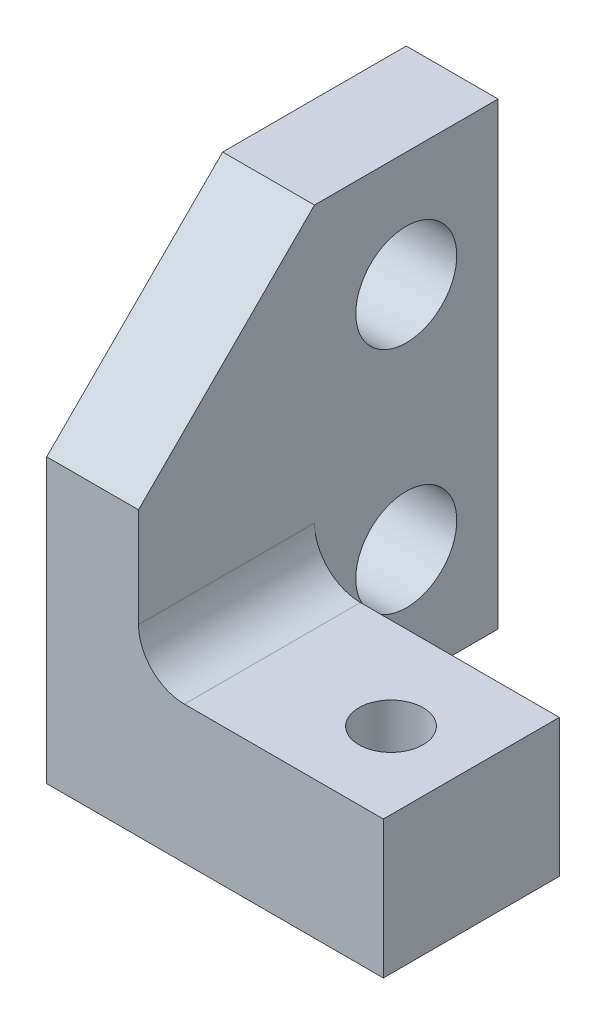
ISO-10303-21;
HEADER;
FILE_DESCRIPTION(('STEP AP214'),'2;1');
FILE_NAME('part.step','',(''),(''),'','','');
FILE_SCHEMA(('AUTOMOTIVE_DESIGN { 1 0 10303 214 1 1 1 1 }'));
ENDSEC;
DATA;
#1=APPLICATION_CONTEXT('core data for automotive mechanical design processes');
#2=APPLICATION_PROTOCOL_DEFINITION('international standard','automotive_design',2000,#1);
#3=PRODUCT_CONTEXT('',#1,'mechanical');
#4=PRODUCT('Part','Part','',(#3));
#5=PRODUCT_RELATED_PRODUCT_CATEGORY('part','',(#4));
#6=PRODUCT_DEFINITION_FORMATION('','',#4);
#7=PRODUCT_DEFINITION_CONTEXT('part definition',#1,'design');
#8=PRODUCT_DEFINITION('design','',#6,#7);
#9=PRODUCT_DEFINITION_SHAPE('','',#8);
#10=(LENGTH_UNIT() NAMED_UNIT(*) SI_UNIT(.MILLI.,.METRE.));
#11=(NAMED_UNIT(*) PLANE_ANGLE_UNIT() SI_UNIT($,.RADIAN.));
#12=(NAMED_UNIT(*) SI_UNIT($,.STERADIAN.) SOLID_ANGLE_UNIT());
#13=UNCERTAINTY_MEASURE_WITH_UNIT(LENGTH_MEASURE(1.E-05),#10,'distance_accuracy_value','');
#14=(GEOMETRIC_REPRESENTATION_CONTEXT(3) GLOBAL_UNCERTAINTY_ASSIGNED_CONTEXT((#13)) GLOBAL_UNIT_ASSIGNED_CONTEXT((#10,
#11,#12)) REPRESENTATION_CONTEXT('',''));
#15=CARTESIAN_POINT('',(0.,0.,0.));
#16=DIRECTION('',(0.,0.,1.));
#17=DIRECTION('',(1.,0.,0.));
#18=AXIS2_PLACEMENT_3D('',#15,#16,#17);
#19=CARTESIAN_POINT('',(11.,-15.,23.5));
#20=DIRECTION('',(-1.,0.,0.));
#21=DIRECTION('',(0.,0.,1.));
#22=AXIS2_PLACEMENT_3D('',#19,#20,#21);
#23=PLANE('',#22);
#24=DIRECTION('',(0.,1.,0.));
#25=VECTOR('',#24,1.);
#26=CARTESIAN_POINT('',(11.,-15.,12.));
#27=LINE('',#26,#25);
#28=CARTESIAN_POINT('',(11.,-15.,12.));
#29=VERTEX_POINT('',#28);
#30=CARTESIAN_POINT('',(11.,-6.,12.));
#31=VERTEX_POINT('',#30);
#32=EDGE_CURVE('E183',#29,#31,#27,.T.);
#33=ORIENTED_EDGE('',*,*,#32,.T.);
#34=DIRECTION('',(0.,0.,1.));
#35=VECTOR('',#34,1.);
#36=CARTESIAN_POINT('',(11.,-6.,0.));
#37=LINE('',#36,#35);
#38=CARTESIAN_POINT('',(11.,-6.,23.5));
#39=VERTEX_POINT('',#38);
#40=EDGE_CURVE('E167',#31,#39,#37,.T.);
#41=ORIENTED_EDGE('',*,*,#40,.T.);
#42=DIRECTION('',(0.,1.,0.));
#43=VECTOR('',#42,1.);
#44=CARTESIAN_POINT('',(11.,-15.,23.5));
#45=LINE('',#44,#43);
#46=CARTESIAN_POINT('',(11.,-15.,23.5));
#47=VERTEX_POINT('',#46);
#48=EDGE_CURVE('E187',#47,#39,#45,.T.);
#49=ORIENTED_EDGE('',*,*,#48,.F.);
#50=DIRECTION('',(0.,0.,-1.));
#51=VECTOR('',#50,1.);
#52=CARTESIAN_POINT('',(11.,-15.,23.5));
#53=LINE('',#52,#51);
#54=EDGE_CURVE('E138',#47,#29,#53,.T.);
#55=ORIENTED_EDGE('',*,*,#54,.T.);
#56=EDGE_LOOP('',(#33,#41,#49,#55));
#57=FACE_BOUND('',#56,.T.);
#58=ADVANCED_FACE('F39',(#57),#23,.F.);
#59=CARTESIAN_POINT('',(-11.,15.,23.5));
#60=DIRECTION('',(0.,-1.,0.));
#61=DIRECTION('',(0.,0.,-1.));
#62=AXIS2_PLACEMENT_3D('',#59,#60,#61);
#63=PLANE('',#62);
#64=DIRECTION('',(0.,0.,-1.));
#65=VECTOR('',#64,1.);
#66=CARTESIAN_POINT('',(-11.,15.,23.5));
#67=LINE('',#66,#65);
#68=CARTESIAN_POINT('',(-11.,15.,12.));
#69=VERTEX_POINT('',#68);
#70=CARTESIAN_POINT('',(-11.,15.,0.));
#71=VERTEX_POINT('',#70);
#72=EDGE_CURVE('E124',#69,#71,#67,.T.);
#73=ORIENTED_EDGE('',*,*,#72,.F.);
#74=DIRECTION('',(-1.,0.,0.));
#75=VECTOR('',#74,1.);
#76=CARTESIAN_POINT('',(11.,15.,12.));
#77=LINE('',#76,#75);
#78=CARTESIAN_POINT('',(-5.,15.,12.));
#79=VERTEX_POINT('',#78);
#80=EDGE_CURVE('E108',#79,#69,#77,.T.);
#81=ORIENTED_EDGE('',*,*,#80,.F.);
#82=DIRECTION('',(0.,0.,1.));
#83=VECTOR('',#82,1.);
#84=CARTESIAN_POINT('',(-5.,15.,0.));
#85=LINE('',#84,#83);
#86=CARTESIAN_POINT('',(-5.,15.,0.));
#87=VERTEX_POINT('',#86);
#88=EDGE_CURVE('E169',#87,#79,#85,.T.);
#89=ORIENTED_EDGE('',*,*,#88,.F.);
#90=DIRECTION('',(-1.,0.,0.));
#91=VECTOR('',#90,1.);
#92=CARTESIAN_POINT('',(-11.,15.,0.));
#93=LINE('',#92,#91);
#94=EDGE_CURVE('E131',#87,#71,#93,.T.);
#95=ORIENTED_EDGE('',*,*,#94,.T.);
#96=EDGE_LOOP('',(#73,#81,#89,#95));
#97=FACE_BOUND('',#96,.T.);
#98=ADVANCED_FACE('F129',(#97),#63,.F.);
#99=CARTESIAN_POINT('',(-11.,-15.,23.5));
#100=DIRECTION('',(1.,0.,0.));
#101=DIRECTION('',(0.,0.,-1.));
#102=AXIS2_PLACEMENT_3D('',#99,#100,#101);
#103=PLANE('',#102);
#104=CARTESIAN_POINT('',(-11.,7.5,6.));
#105=DIRECTION('',(-1.,0.,0.));
#106=DIRECTION('',(0.,0.,1.));
#107=AXIS2_PLACEMENT_3D('',#104,#105,#106);
#108=CIRCLE('',#107,3.29999999999999);
#109=CARTESIAN_POINT('',(-11.,7.5,9.29999999999998));
#110=VERTEX_POINT('',#109);
#111=EDGE_CURVE('E149',#110,#110,#108,.T.);
#112=ORIENTED_EDGE('',*,*,#111,.F.);
#113=EDGE_LOOP('',(#112));
#114=FACE_BOUND('',#113,.T.);
#115=CARTESIAN_POINT('',(-11.,-7.5,6.));
#116=DIRECTION('',(-1.,0.,0.));
#117=DIRECTION('',(0.,0.,1.));
#118=AXIS2_PLACEMENT_3D('',#115,#116,#117);
#119=CIRCLE('',#118,3.29999999999999);
#120=CARTESIAN_POINT('',(-11.,-7.5,9.29999999999999));
#121=VERTEX_POINT('',#120);
#122=EDGE_CURVE('E146',#121,#121,#119,.T.);
#123=ORIENTED_EDGE('',*,*,#122,.F.);
#124=EDGE_LOOP('',(#123));
#125=FACE_BOUND('',#124,.T.);
#126=DIRECTION('',(0.,-1.,0.));
#127=VECTOR('',#126,1.);
#128=CARTESIAN_POINT('',(-11.,-15.,23.5));
#129=LINE('',#128,#127);
#130=CARTESIAN_POINT('',(-11.,3.5,23.5));
#131=VERTEX_POINT('',#130);
#132=CARTESIAN_POINT('',(-11.,-15.,23.5));
#133=VERTEX_POINT('',#132);
#134=EDGE_CURVE('E127',#131,#133,#129,.T.);
#135=ORIENTED_EDGE('',*,*,#134,.F.);
#136=DIRECTION('',(0.,-0.707106781186548,0.707106781186548));
#137=VECTOR('',#136,1.);
#138=CARTESIAN_POINT('',(-11.,15.,12.));
#139=LINE('',#138,#137);
#140=EDGE_CURVE('E111',#69,#131,#139,.T.);
#141=ORIENTED_EDGE('',*,*,#140,.F.);
#142=ORIENTED_EDGE('',*,*,#72,.T.);
#143=DIRECTION('',(0.,-1.,0.));
#144=VECTOR('',#143,1.);
#145=CARTESIAN_POINT('',(-11.,-15.,0.));
#146=LINE('',#145,#144);
#147=CARTESIAN_POINT('',(-11.,-15.,0.));
#148=VERTEX_POINT('',#147);
#149=EDGE_CURVE('E195',#71,#148,#146,.T.);
#150=ORIENTED_EDGE('',*,*,#149,.T.);
#151=DIRECTION('',(0.,0.,-1.));
#152=VECTOR('',#151,1.);
#153=CARTESIAN_POINT('',(-11.,-15.,23.5));
#154=LINE('',#153,#152);
#155=EDGE_CURVE('E133',#133,#148,#154,.T.);
#156=ORIENTED_EDGE('',*,*,#155,.F.);
#157=EDGE_LOOP('',(#135,#141,#142,#150,#156));
#158=FACE_BOUND('',#157,.T.);
#159=ADVANCED_FACE('F123',(#114,#125,#158),#103,.F.);
#160=CARTESIAN_POINT('',(-11.,-15.,23.5));
#161=DIRECTION('',(0.,1.,0.));
#162=DIRECTION('',(0.,0.,1.));
#163=AXIS2_PLACEMENT_3D('',#160,#161,#162);
#164=PLANE('',#163);
#165=CARTESIAN_POINT('',(6.,-15.,18.));
#166=DIRECTION('',(0.,-1.,0.));
#167=DIRECTION('',(0.,0.,-1.));
#168=AXIS2_PLACEMENT_3D('',#165,#166,#167);
#169=CIRCLE('',#168,2.09999999999999);
#170=CARTESIAN_POINT('',(6.,-15.,15.9));
#171=VERTEX_POINT('',#170);
#172=EDGE_CURVE('E233',#171,#171,#169,.T.);
#173=ORIENTED_EDGE('',*,*,#172,.F.);
#174=EDGE_LOOP('',(#173));
#175=FACE_BOUND('',#174,.T.);
#176=DIRECTION('',(0.,0.,1.));
#177=VECTOR('',#176,1.);
#178=CARTESIAN_POINT('',(-5.,-15.,0.));
#179=LINE('',#178,#177);
#180=CARTESIAN_POINT('',(-5.,-15.,0.));
#181=VERTEX_POINT('',#180);
#182=CARTESIAN_POINT('',(-5.,-15.,12.));
#183=VERTEX_POINT('',#182);
#184=EDGE_CURVE('E171',#181,#183,#179,.T.);
#185=ORIENTED_EDGE('',*,*,#184,.T.);
#186=DIRECTION('',(1.,0.,0.));
#187=VECTOR('',#186,1.);
#188=CARTESIAN_POINT('',(11.,-15.,12.));
#189=LINE('',#188,#187);
#190=EDGE_CURVE('E179',#183,#29,#189,.T.);
#191=ORIENTED_EDGE('',*,*,#190,.T.);
#192=ORIENTED_EDGE('',*,*,#54,.F.);
#193=DIRECTION('',(1.,0.,0.));
#194=VECTOR('',#193,1.);
#195=CARTESIAN_POINT('',(-11.,-15.,23.5));
#196=LINE('',#195,#194);
#197=EDGE_CURVE('E192',#133,#47,#196,.T.);
#198=ORIENTED_EDGE('',*,*,#197,.F.);
#199=ORIENTED_EDGE('',*,*,#155,.T.);
#200=DIRECTION('',(1.,0.,0.));
#201=VECTOR('',#200,1.);
#202=CARTESIAN_POINT('',(-11.,-15.,0.));
#203=LINE('',#202,#201);
#204=EDGE_CURVE('E190',#148,#181,#203,.T.);
#205=ORIENTED_EDGE('',*,*,#204,.T.);
#206=EDGE_LOOP('',(#185,#191,#192,#198,#199,#205));
#207=FACE_BOUND('',#206,.T.);
#208=ADVANCED_FACE('F204',(#175,#207),#164,.F.);
#209=CARTESIAN_POINT('',(0.,0.,23.5));
#210=DIRECTION('',(0.,0.,-1.));
#211=DIRECTION('',(-1.,0.,0.));
#212=AXIS2_PLACEMENT_3D('',#209,#210,#211);
#213=PLANE('',#212);
#214=DIRECTION('',(0.,-1.,0.));
#215=VECTOR('',#214,1.);
#216=CARTESIAN_POINT('',(-5.,-6.,23.5));
#217=LINE('',#216,#215);
#218=CARTESIAN_POINT('',(-5.,3.49999999999999,23.5));
#219=VERTEX_POINT('',#218);
#220=CARTESIAN_POINT('',(-5.,-3.,23.5));
#221=VERTEX_POINT('',#220);
#222=EDGE_CURVE('E145',#219,#221,#217,.T.);
#223=ORIENTED_EDGE('',*,*,#222,.F.);
#224=DIRECTION('',(-1.,0.,0.));
#225=VECTOR('',#224,1.);
#226=CARTESIAN_POINT('',(11.,3.5,23.5));
#227=LINE('',#226,#225);
#228=EDGE_CURVE('E119',#219,#131,#227,.T.);
#229=ORIENTED_EDGE('',*,*,#228,.T.);
#230=ORIENTED_EDGE('',*,*,#134,.T.);
#231=ORIENTED_EDGE('',*,*,#197,.T.);
#232=ORIENTED_EDGE('',*,*,#48,.T.);
#233=DIRECTION('',(1.,0.,0.));
#234=VECTOR('',#233,1.);
#235=CARTESIAN_POINT('',(11.,-6.,23.5));
#236=LINE('',#235,#234);
#237=CARTESIAN_POINT('',(-1.99999999999999,-6.,23.5));
#238=VERTEX_POINT('',#237);
#239=EDGE_CURVE('E173',#238,#39,#236,.T.);
#240=ORIENTED_EDGE('',*,*,#239,.F.);
#241=CARTESIAN_POINT('',(-1.99999999999999,-3.,23.5));
#242=DIRECTION('',(0.,0.,-1.));
#243=DIRECTION('',(-1.,0.,0.));
#244=AXIS2_PLACEMENT_3D('',#241,#242,#243);
#245=CIRCLE('',#244,3.);
#246=EDGE_CURVE('E47',#238,#221,#245,.T.);
#247=ORIENTED_EDGE('',*,*,#246,.T.);
#248=EDGE_LOOP('',(#223,#229,#230,#231,#232,#240,#247));
#249=FACE_BOUND('',#248,.T.);
#250=ADVANCED_FACE('F210',(#249),#213,.F.);
#251=CARTESIAN_POINT('',(0.,0.,0.));
#252=DIRECTION('',(0.,0.,-1.));
#253=DIRECTION('',(-1.,0.,0.));
#254=AXIS2_PLACEMENT_3D('',#251,#252,#253);
#255=PLANE('',#254);
#256=DIRECTION('',(0.,1.,0.));
#257=VECTOR('',#256,1.);
#258=CARTESIAN_POINT('',(-5.,-15.,0.));
#259=LINE('',#258,#257);
#260=EDGE_CURVE('E181',#181,#87,#259,.T.);
#261=ORIENTED_EDGE('',*,*,#260,.F.);
#262=ORIENTED_EDGE('',*,*,#204,.F.);
#263=ORIENTED_EDGE('',*,*,#149,.F.);
#264=ORIENTED_EDGE('',*,*,#94,.F.);
#265=EDGE_LOOP('',(#261,#262,#263,#264));
#266=FACE_BOUND('',#265,.T.);
#267=ADVANCED_FACE('F208',(#266),#255,.T.);
#268=CARTESIAN_POINT('',(11.,-15.,12.));
#269=DIRECTION('',(0.,0.,1.));
#270=DIRECTION('',(1.,0.,0.));
#271=AXIS2_PLACEMENT_3D('',#268,#269,#270);
#272=PLANE('',#271);
#273=DIRECTION('',(0.,1.,0.));
#274=VECTOR('',#273,1.);
#275=CARTESIAN_POINT('',(-5.,-15.,12.));
#276=LINE('',#275,#274);
#277=CARTESIAN_POINT('',(-5.,-3.,12.));
#278=VERTEX_POINT('',#277);
#279=EDGE_CURVE('E53',#183,#278,#276,.T.);
#280=ORIENTED_EDGE('',*,*,#279,.T.);
#281=CARTESIAN_POINT('',(-1.99999999999999,-3.,12.));
#282=DIRECTION('',(0.,0.,1.));
#283=DIRECTION('',(1.,0.,0.));
#284=AXIS2_PLACEMENT_3D('',#281,#282,#283);
#285=CIRCLE('',#284,3.);
#286=CARTESIAN_POINT('',(-1.99999999999999,-6.,12.));
#287=VERTEX_POINT('',#286);
#288=EDGE_CURVE('E11',#278,#287,#285,.T.);
#289=ORIENTED_EDGE('',*,*,#288,.T.);
#290=DIRECTION('',(1.,0.,0.));
#291=VECTOR('',#290,1.);
#292=CARTESIAN_POINT('',(11.,-6.,12.));
#293=LINE('',#292,#291);
#294=EDGE_CURVE('E162',#287,#31,#293,.T.);
#295=ORIENTED_EDGE('',*,*,#294,.T.);
#296=ORIENTED_EDGE('',*,*,#32,.F.);
#297=ORIENTED_EDGE('',*,*,#190,.F.);
#298=EDGE_LOOP('',(#280,#289,#295,#296,#297));
#299=FACE_BOUND('',#298,.T.);
#300=ADVANCED_FACE('F161',(#299),#272,.F.);
#301=CARTESIAN_POINT('',(-5.,-15.,0.));
#302=DIRECTION('',(-1.,0.,0.));
#303=DIRECTION('',(0.,0.,1.));
#304=AXIS2_PLACEMENT_3D('',#301,#302,#303);
#305=PLANE('',#304);
#306=CARTESIAN_POINT('',(-5.,7.5,6.));
#307=DIRECTION('',(-1.,0.,0.));
#308=DIRECTION('',(0.,0.,1.));
#309=AXIS2_PLACEMENT_3D('',#306,#307,#308);
#310=CIRCLE('',#309,3.29999999999999);
#311=CARTESIAN_POINT('',(-5.,7.5,9.29999999999999));
#312=VERTEX_POINT('',#311);
#313=EDGE_CURVE('E147',#312,#312,#310,.T.);
#314=ORIENTED_EDGE('',*,*,#313,.T.);
#315=EDGE_LOOP('',(#314));
#316=FACE_BOUND('',#315,.T.);
#317=CARTESIAN_POINT('',(-5.,-7.5,6.));
#318=DIRECTION('',(-1.,0.,0.));
#319=DIRECTION('',(0.,0.,1.));
#320=AXIS2_PLACEMENT_3D('',#317,#318,#319);
#321=CIRCLE('',#320,3.29999999999999);
#322=CARTESIAN_POINT('',(-5.,-7.5,9.29999999999999));
#323=VERTEX_POINT('',#322);
#324=EDGE_CURVE('E142',#323,#323,#321,.T.);
#325=ORIENTED_EDGE('',*,*,#324,.T.);
#326=EDGE_LOOP('',(#325));
#327=FACE_BOUND('',#326,.T.);
#328=ORIENTED_EDGE('',*,*,#222,.T.);
#329=DIRECTION('',(0.,0.,1.));
#330=VECTOR('',#329,1.);
#331=CARTESIAN_POINT('',(-5.,-3.,12.));
#332=LINE('',#331,#330);
#333=EDGE_CURVE('E153',#221,#278,#332,.F.);
#334=ORIENTED_EDGE('',*,*,#333,.T.);
#335=ORIENTED_EDGE('',*,*,#279,.F.);
#336=ORIENTED_EDGE('',*,*,#184,.F.);
#337=ORIENTED_EDGE('',*,*,#260,.T.);
#338=ORIENTED_EDGE('',*,*,#88,.T.);
#339=DIRECTION('',(0.,-0.707106781186548,0.707106781186548));
#340=VECTOR('',#339,1.);
#341=CARTESIAN_POINT('',(-4.99999999999999,5.99999999999999,21.));
#342=LINE('',#341,#340);
#343=EDGE_CURVE('E114',#79,#219,#342,.T.);
#344=ORIENTED_EDGE('',*,*,#343,.T.);
#345=EDGE_LOOP('',(#328,#334,#335,#336,#337,#338,#344));
#346=FACE_BOUND('',#345,.T.);
#347=ADVANCED_FACE('F157',(#316,#327,#346),#305,.F.);
#348=CARTESIAN_POINT('',(11.,-6.,0.));
#349=DIRECTION('',(0.,-1.,0.));
#350=DIRECTION('',(1.,0.,0.));
#351=AXIS2_PLACEMENT_3D('',#348,#349,#350);
#352=PLANE('',#351);
#353=CARTESIAN_POINT('',(6.,-6.,18.));
#354=DIRECTION('',(0.,-1.,0.));
#355=DIRECTION('',(1.,0.,0.));
#356=AXIS2_PLACEMENT_3D('',#353,#354,#355);
#357=CIRCLE('',#356,2.09999999999999);
#358=CARTESIAN_POINT('',(8.09999999999999,-6.,18.));
#359=VERTEX_POINT('',#358);
#360=EDGE_CURVE('E235',#359,#359,#357,.T.);
#361=ORIENTED_EDGE('',*,*,#360,.T.);
#362=EDGE_LOOP('',(#361));
#363=FACE_BOUND('',#362,.T.);
#364=ORIENTED_EDGE('',*,*,#294,.F.);
#365=DIRECTION('',(0.,0.,1.));
#366=VECTOR('',#365,1.);
#367=CARTESIAN_POINT('',(-1.99999999999999,-6.,23.5));
#368=LINE('',#367,#366);
#369=EDGE_CURVE('E135',#287,#238,#368,.T.);
#370=ORIENTED_EDGE('',*,*,#369,.T.);
#371=ORIENTED_EDGE('',*,*,#239,.T.);
#372=ORIENTED_EDGE('',*,*,#40,.F.);
#373=EDGE_LOOP('',(#364,#370,#371,#372));
#374=FACE_BOUND('',#373,.T.);
#375=ADVANCED_FACE('F165',(#363,#374),#352,.F.);
#376=CARTESIAN_POINT('',(-11.,-7.5,6.));
#377=DIRECTION('',(-1.,0.,0.));
#378=DIRECTION('',(0.,0.,1.));
#379=AXIS2_PLACEMENT_3D('',#376,#377,#378);
#380=CYLINDRICAL_SURFACE('',#379,3.29999999999999);
#381=ORIENTED_EDGE('',*,*,#122,.T.);
#382=EDGE_LOOP('',(#381));
#383=FACE_BOUND('',#382,.T.);
#384=ORIENTED_EDGE('',*,*,#324,.F.);
#385=EDGE_LOOP('',(#384));
#386=FACE_BOUND('',#385,.T.);
#387=ADVANCED_FACE('F247',(#383,#386),#380,.F.);
#388=CARTESIAN_POINT('',(-11.,7.5,6.));
#389=DIRECTION('',(-1.,0.,0.));
#390=DIRECTION('',(0.,0.,1.));
#391=AXIS2_PLACEMENT_3D('',#388,#389,#390);
#392=CYLINDRICAL_SURFACE('',#391,3.29999999999999);
#393=ORIENTED_EDGE('',*,*,#111,.T.);
#394=EDGE_LOOP('',(#393));
#395=FACE_BOUND('',#394,.T.);
#396=ORIENTED_EDGE('',*,*,#313,.F.);
#397=EDGE_LOOP('',(#396));
#398=FACE_BOUND('',#397,.T.);
#399=ADVANCED_FACE('F251',(#395,#398),#392,.F.);
#400=CARTESIAN_POINT('',(6.,-15.,18.));
#401=DIRECTION('',(0.,-1.,0.));
#402=DIRECTION('',(0.,0.,-1.));
#403=AXIS2_PLACEMENT_3D('',#400,#401,#402);
#404=CYLINDRICAL_SURFACE('',#403,2.09999999999999);
#405=ORIENTED_EDGE('',*,*,#172,.T.);
#406=EDGE_LOOP('',(#405));
#407=FACE_BOUND('',#406,.T.);
#408=ORIENTED_EDGE('',*,*,#360,.F.);
#409=EDGE_LOOP('',(#408));
#410=FACE_BOUND('',#409,.T.);
#411=ADVANCED_FACE('F266',(#407,#410),#404,.F.);
#412=CARTESIAN_POINT('',(11.,15.,12.));
#413=DIRECTION('',(0.,-0.707106781186548,-0.707106781186548));
#414=DIRECTION('',(0.,0.707106781186548,-0.707106781186548));
#415=AXIS2_PLACEMENT_3D('',#412,#413,#414);
#416=PLANE('',#415);
#417=ORIENTED_EDGE('',*,*,#80,.T.);
#418=ORIENTED_EDGE('',*,*,#140,.T.);
#419=ORIENTED_EDGE('',*,*,#228,.F.);
#420=ORIENTED_EDGE('',*,*,#343,.F.);
#421=EDGE_LOOP('',(#417,#418,#419,#420));
#422=FACE_BOUND('',#421,.T.);
#423=ADVANCED_FACE('F110',(#422),#416,.F.);
#424=CARTESIAN_POINT('',(-2.,-3.,0.));
#425=DIRECTION('',(0.,0.,-1.));
#426=DIRECTION('',(-1.,0.,0.));
#427=AXIS2_PLACEMENT_3D('',#424,#425,#426);
#428=CYLINDRICAL_SURFACE('',#427,3.);
#429=ORIENTED_EDGE('',*,*,#288,.F.);
#430=ORIENTED_EDGE('',*,*,#333,.F.);
#431=ORIENTED_EDGE('',*,*,#246,.F.);
#432=ORIENTED_EDGE('',*,*,#369,.F.);
#433=EDGE_LOOP('',(#429,#430,#431,#432));
#434=FACE_BOUND('',#433,.T.);
#435=ADVANCED_FACE('F41',(#434),#428,.F.);
#436=CLOSED_SHELL('',(#58,#98,#159,#208,#250,#267,#300,#347,#375,#387,#399,#411,#423,#435));
#437=MANIFOLD_SOLID_BREP('B2',#436);
#438=ADVANCED_BREP_SHAPE_REPRESENTATION('',(#18,#437),#14);
#439=SHAPE_DEFINITION_REPRESENTATION(#9,#438);
ENDSEC;
END-ISO-10303-21;
